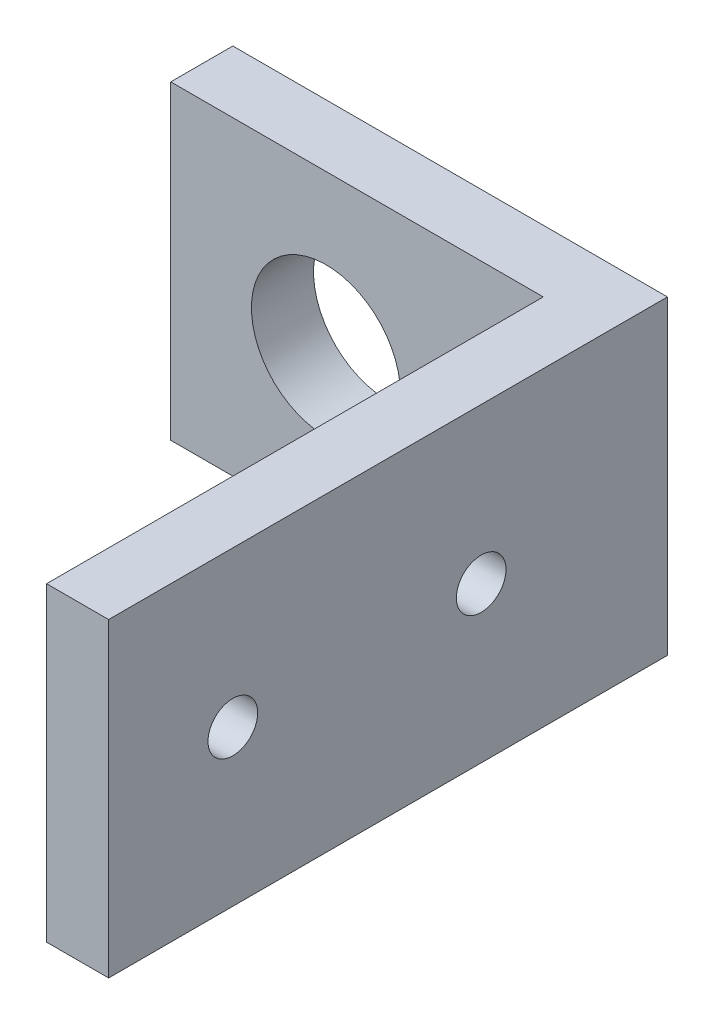
ISO-10303-21;
HEADER;
FILE_DESCRIPTION(('STEP AP214'),'2;1');
FILE_NAME('part.step','',(''),(''),'','','');
FILE_SCHEMA(('AUTOMOTIVE_DESIGN { 1 0 10303 214 1 1 1 1 }'));
ENDSEC;
DATA;
#1=APPLICATION_CONTEXT('core data for automotive mechanical design processes');
#2=APPLICATION_PROTOCOL_DEFINITION('international standard','automotive_design',2000,#1);
#3=PRODUCT_CONTEXT('',#1,'mechanical');
#4=PRODUCT('Part','Part','',(#3));
#5=PRODUCT_RELATED_PRODUCT_CATEGORY('part','',(#4));
#6=PRODUCT_DEFINITION_FORMATION('','',#4);
#7=PRODUCT_DEFINITION_CONTEXT('part definition',#1,'design');
#8=PRODUCT_DEFINITION('design','',#6,#7);
#9=PRODUCT_DEFINITION_SHAPE('','',#8);
#10=(LENGTH_UNIT() NAMED_UNIT(*) SI_UNIT(.MILLI.,.METRE.));
#11=(NAMED_UNIT(*) PLANE_ANGLE_UNIT() SI_UNIT($,.RADIAN.));
#12=(NAMED_UNIT(*) SI_UNIT($,.STERADIAN.) SOLID_ANGLE_UNIT());
#13=UNCERTAINTY_MEASURE_WITH_UNIT(LENGTH_MEASURE(1.E-05),#10,'distance_accuracy_value','');
#14=(GEOMETRIC_REPRESENTATION_CONTEXT(3) GLOBAL_UNCERTAINTY_ASSIGNED_CONTEXT((#13)) GLOBAL_UNIT_ASSIGNED_CONTEXT((#10,
#11,#12)) REPRESENTATION_CONTEXT('',''));
#15=CARTESIAN_POINT('',(0.,0.,0.));
#16=DIRECTION('',(0.,0.,1.));
#17=DIRECTION('',(1.,0.,0.));
#18=AXIS2_PLACEMENT_3D('',#15,#16,#17);
#19=CARTESIAN_POINT('',(0.,0.,5.));
#20=DIRECTION('',(0.,0.,-1.));
#21=DIRECTION('',(-1.,0.,0.));
#22=AXIS2_PLACEMENT_3D('',#19,#20,#21);
#23=PLANE('',#22);
#24=CARTESIAN_POINT('',(12.5,12.5,5.));
#25=DIRECTION('',(0.,0.,1.));
#26=DIRECTION('',(1.,0.,0.));
#27=AXIS2_PLACEMENT_3D('',#24,#25,#26);
#28=CIRCLE('',#27,6.);
#29=CARTESIAN_POINT('',(18.5,12.5,5.));
#30=VERTEX_POINT('',#29);
#31=EDGE_CURVE('E235',#30,#30,#28,.T.);
#32=ORIENTED_EDGE('',*,*,#31,.F.);
#33=EDGE_LOOP('',(#32));
#34=FACE_BOUND('',#33,.T.);
#35=DIRECTION('',(0.,-1.,0.));
#36=VECTOR('',#35,1.);
#37=CARTESIAN_POINT('',(30.,25.,5.));
#38=LINE('',#37,#36);
#39=CARTESIAN_POINT('',(30.,25.,5.));
#40=VERTEX_POINT('',#39);
#41=CARTESIAN_POINT('',(30.,0.,5.));
#42=VERTEX_POINT('',#41);
#43=EDGE_CURVE('E48',#40,#42,#38,.T.);
#44=ORIENTED_EDGE('',*,*,#43,.F.);
#45=DIRECTION('',(-1.,0.,0.));
#46=VECTOR('',#45,1.);
#47=CARTESIAN_POINT('',(0.,25.,5.));
#48=LINE('',#47,#46);
#49=CARTESIAN_POINT('',(0.,25.,5.));
#50=VERTEX_POINT('',#49);
#51=EDGE_CURVE('E53',#40,#50,#48,.T.);
#52=ORIENTED_EDGE('',*,*,#51,.T.);
#53=DIRECTION('',(0.,-1.,0.));
#54=VECTOR('',#53,1.);
#55=CARTESIAN_POINT('',(0.,0.,5.));
#56=LINE('',#55,#54);
#57=CARTESIAN_POINT('',(0.,0.,5.));
#58=VERTEX_POINT('',#57);
#59=EDGE_CURVE('E84',#50,#58,#56,.T.);
#60=ORIENTED_EDGE('',*,*,#59,.T.);
#61=DIRECTION('',(1.,0.,0.));
#62=VECTOR('',#61,1.);
#63=CARTESIAN_POINT('',(0.,0.,5.));
#64=LINE('',#63,#62);
#65=EDGE_CURVE('E138',#58,#42,#64,.T.);
#66=ORIENTED_EDGE('',*,*,#65,.T.);
#67=EDGE_LOOP('',(#44,#52,#60,#66));
#68=FACE_BOUND('',#67,.T.);
#69=ADVANCED_FACE('F33',(#34,#68),#23,.F.);
#70=CARTESIAN_POINT('',(0.,0.,5.));
#71=DIRECTION('',(1.,0.,0.));
#72=DIRECTION('',(0.,0.,-1.));
#73=AXIS2_PLACEMENT_3D('',#70,#71,#72);
#74=PLANE('',#73);
#75=DIRECTION('',(0.,-1.,0.));
#76=VECTOR('',#75,1.);
#77=CARTESIAN_POINT('',(0.,0.,0.));
#78=LINE('',#77,#76);
#79=CARTESIAN_POINT('',(0.,25.,0.));
#80=VERTEX_POINT('',#79);
#81=CARTESIAN_POINT('',(0.,0.,0.));
#82=VERTEX_POINT('',#81);
#83=EDGE_CURVE('E90',#80,#82,#78,.T.);
#84=ORIENTED_EDGE('',*,*,#83,.T.);
#85=DIRECTION('',(0.,0.,-1.));
#86=VECTOR('',#85,1.);
#87=CARTESIAN_POINT('',(0.,0.,5.));
#88=LINE('',#87,#86);
#89=EDGE_CURVE('E11',#58,#82,#88,.T.);
#90=ORIENTED_EDGE('',*,*,#89,.F.);
#91=ORIENTED_EDGE('',*,*,#59,.F.);
#92=DIRECTION('',(0.,0.,-1.));
#93=VECTOR('',#92,1.);
#94=CARTESIAN_POINT('',(0.,25.,5.));
#95=LINE('',#94,#93);
#96=EDGE_CURVE('E76',#50,#80,#95,.T.);
#97=ORIENTED_EDGE('',*,*,#96,.T.);
#98=EDGE_LOOP('',(#84,#90,#91,#97));
#99=FACE_BOUND('',#98,.T.);
#100=ADVANCED_FACE('F35',(#99),#74,.F.);
#101=CARTESIAN_POINT('',(0.,0.,5.));
#102=DIRECTION('',(0.,1.,0.));
#103=DIRECTION('',(0.,0.,1.));
#104=AXIS2_PLACEMENT_3D('',#101,#102,#103);
#105=PLANE('',#104);
#106=DIRECTION('',(1.,0.,0.));
#107=VECTOR('',#106,1.);
#108=CARTESIAN_POINT('',(0.,0.,0.));
#109=LINE('',#108,#107);
#110=CARTESIAN_POINT('',(35.,0.,0.));
#111=VERTEX_POINT('',#110);
#112=EDGE_CURVE('E93',#82,#111,#109,.T.);
#113=ORIENTED_EDGE('',*,*,#112,.T.);
#114=DIRECTION('',(0.,0.,-1.));
#115=VECTOR('',#114,1.);
#116=CARTESIAN_POINT('',(35.,0.,5.));
#117=LINE('',#116,#115);
#118=CARTESIAN_POINT('',(35.,0.,45.));
#119=VERTEX_POINT('',#118);
#120=EDGE_CURVE('E41',#119,#111,#117,.T.);
#121=ORIENTED_EDGE('',*,*,#120,.F.);
#122=DIRECTION('',(1.,0.,0.));
#123=VECTOR('',#122,1.);
#124=CARTESIAN_POINT('',(30.,0.,45.));
#125=LINE('',#124,#123);
#126=CARTESIAN_POINT('',(30.,0.,45.));
#127=VERTEX_POINT('',#126);
#128=EDGE_CURVE('E117',#127,#119,#125,.T.);
#129=ORIENTED_EDGE('',*,*,#128,.F.);
#130=DIRECTION('',(0.,0.,-1.));
#131=VECTOR('',#130,1.);
#132=CARTESIAN_POINT('',(30.,0.,45.));
#133=LINE('',#132,#131);
#134=EDGE_CURVE('E94',#127,#42,#133,.T.);
#135=ORIENTED_EDGE('',*,*,#134,.T.);
#136=ORIENTED_EDGE('',*,*,#65,.F.);
#137=ORIENTED_EDGE('',*,*,#89,.T.);
#138=EDGE_LOOP('',(#113,#121,#129,#135,#136,#137));
#139=FACE_BOUND('',#138,.T.);
#140=ADVANCED_FACE('F115',(#139),#105,.F.);
#141=CARTESIAN_POINT('',(35.,0.,5.));
#142=DIRECTION('',(-1.,0.,0.));
#143=DIRECTION('',(0.,0.,1.));
#144=AXIS2_PLACEMENT_3D('',#141,#142,#143);
#145=PLANE('',#144);
#146=CARTESIAN_POINT('',(35.,12.5,15.));
#147=DIRECTION('',(-1.,0.,0.));
#148=DIRECTION('',(0.,-1.,0.));
#149=AXIS2_PLACEMENT_3D('',#146,#147,#148);
#150=CIRCLE('',#149,2.);
#151=CARTESIAN_POINT('',(35.,10.5,15.));
#152=VERTEX_POINT('',#151);
#153=EDGE_CURVE('E230',#152,#152,#150,.T.);
#154=ORIENTED_EDGE('',*,*,#153,.T.);
#155=EDGE_LOOP('',(#154));
#156=FACE_BOUND('',#155,.T.);
#157=CARTESIAN_POINT('',(35.,12.5,35.));
#158=DIRECTION('',(-1.,0.,0.));
#159=DIRECTION('',(0.,-1.,0.));
#160=AXIS2_PLACEMENT_3D('',#157,#158,#159);
#161=CIRCLE('',#160,2.);
#162=CARTESIAN_POINT('',(35.,10.5,35.));
#163=VERTEX_POINT('',#162);
#164=EDGE_CURVE('E233',#163,#163,#161,.T.);
#165=ORIENTED_EDGE('',*,*,#164,.T.);
#166=EDGE_LOOP('',(#165));
#167=FACE_BOUND('',#166,.T.);
#168=DIRECTION('',(0.,1.,0.));
#169=VECTOR('',#168,1.);
#170=CARTESIAN_POINT('',(35.,0.,0.));
#171=LINE('',#170,#169);
#172=CARTESIAN_POINT('',(35.,25.,0.));
#173=VERTEX_POINT('',#172);
#174=EDGE_CURVE('E85',#111,#173,#171,.T.);
#175=ORIENTED_EDGE('',*,*,#174,.T.);
#176=DIRECTION('',(0.,0.,-1.));
#177=VECTOR('',#176,1.);
#178=CARTESIAN_POINT('',(35.,25.,5.));
#179=LINE('',#178,#177);
#180=CARTESIAN_POINT('',(35.,25.,45.));
#181=VERTEX_POINT('',#180);
#182=EDGE_CURVE('E80',#181,#173,#179,.T.);
#183=ORIENTED_EDGE('',*,*,#182,.F.);
#184=DIRECTION('',(0.,1.,0.));
#185=VECTOR('',#184,1.);
#186=CARTESIAN_POINT('',(35.,25.,45.));
#187=LINE('',#186,#185);
#188=EDGE_CURVE('E111',#119,#181,#187,.T.);
#189=ORIENTED_EDGE('',*,*,#188,.F.);
#190=ORIENTED_EDGE('',*,*,#120,.T.);
#191=EDGE_LOOP('',(#175,#183,#189,#190));
#192=FACE_BOUND('',#191,.T.);
#193=ADVANCED_FACE('F108',(#156,#167,#192),#145,.F.);
#194=CARTESIAN_POINT('',(0.,25.,5.));
#195=DIRECTION('',(0.,-1.,0.));
#196=DIRECTION('',(0.,0.,-1.));
#197=AXIS2_PLACEMENT_3D('',#194,#195,#196);
#198=PLANE('',#197);
#199=DIRECTION('',(-1.,0.,0.));
#200=VECTOR('',#199,1.);
#201=CARTESIAN_POINT('',(0.,25.,0.));
#202=LINE('',#201,#200);
#203=EDGE_CURVE('E73',#173,#80,#202,.T.);
#204=ORIENTED_EDGE('',*,*,#203,.T.);
#205=ORIENTED_EDGE('',*,*,#96,.F.);
#206=ORIENTED_EDGE('',*,*,#51,.F.);
#207=DIRECTION('',(0.,0.,-1.));
#208=VECTOR('',#207,1.);
#209=CARTESIAN_POINT('',(30.,25.,45.));
#210=LINE('',#209,#208);
#211=CARTESIAN_POINT('',(30.,25.,45.));
#212=VERTEX_POINT('',#211);
#213=EDGE_CURVE('E98',#212,#40,#210,.T.);
#214=ORIENTED_EDGE('',*,*,#213,.F.);
#215=DIRECTION('',(-1.,0.,0.));
#216=VECTOR('',#215,1.);
#217=CARTESIAN_POINT('',(30.,25.,45.));
#218=LINE('',#217,#216);
#219=EDGE_CURVE('E128',#181,#212,#218,.T.);
#220=ORIENTED_EDGE('',*,*,#219,.F.);
#221=ORIENTED_EDGE('',*,*,#182,.T.);
#222=EDGE_LOOP('',(#204,#205,#206,#214,#220,#221));
#223=FACE_BOUND('',#222,.T.);
#224=ADVANCED_FACE('F75',(#223),#198,.F.);
#225=CARTESIAN_POINT('',(0.,0.,0.));
#226=DIRECTION('',(0.,0.,-1.));
#227=DIRECTION('',(-1.,0.,0.));
#228=AXIS2_PLACEMENT_3D('',#225,#226,#227);
#229=PLANE('',#228);
#230=CARTESIAN_POINT('',(12.5,12.5,0.));
#231=DIRECTION('',(0.,0.,1.));
#232=DIRECTION('',(1.,0.,0.));
#233=AXIS2_PLACEMENT_3D('',#230,#231,#232);
#234=CIRCLE('',#233,6.);
#235=CARTESIAN_POINT('',(18.5,12.5,0.));
#236=VERTEX_POINT('',#235);
#237=EDGE_CURVE('E135',#236,#236,#234,.T.);
#238=ORIENTED_EDGE('',*,*,#237,.T.);
#239=EDGE_LOOP('',(#238));
#240=FACE_BOUND('',#239,.T.);
#241=ORIENTED_EDGE('',*,*,#83,.F.);
#242=ORIENTED_EDGE('',*,*,#203,.F.);
#243=ORIENTED_EDGE('',*,*,#174,.F.);
#244=ORIENTED_EDGE('',*,*,#112,.F.);
#245=EDGE_LOOP('',(#241,#242,#243,#244));
#246=FACE_BOUND('',#245,.T.);
#247=ADVANCED_FACE('F92',(#240,#246),#229,.T.);
#248=CARTESIAN_POINT('',(30.,25.,45.));
#249=DIRECTION('',(1.,0.,0.));
#250=DIRECTION('',(0.,1.,0.));
#251=AXIS2_PLACEMENT_3D('',#248,#249,#250);
#252=PLANE('',#251);
#253=CARTESIAN_POINT('',(30.,12.5,15.));
#254=DIRECTION('',(-1.,0.,0.));
#255=DIRECTION('',(0.,-1.,0.));
#256=AXIS2_PLACEMENT_3D('',#253,#254,#255);
#257=CIRCLE('',#256,2.);
#258=CARTESIAN_POINT('',(30.,10.5,15.));
#259=VERTEX_POINT('',#258);
#260=EDGE_CURVE('E232',#259,#259,#257,.T.);
#261=ORIENTED_EDGE('',*,*,#260,.F.);
#262=EDGE_LOOP('',(#261));
#263=FACE_BOUND('',#262,.T.);
#264=CARTESIAN_POINT('',(30.,12.5,35.));
#265=DIRECTION('',(-1.,0.,0.));
#266=DIRECTION('',(0.,-1.,0.));
#267=AXIS2_PLACEMENT_3D('',#264,#265,#266);
#268=CIRCLE('',#267,2.);
#269=CARTESIAN_POINT('',(30.,10.5,35.));
#270=VERTEX_POINT('',#269);
#271=EDGE_CURVE('E238',#270,#270,#268,.T.);
#272=ORIENTED_EDGE('',*,*,#271,.F.);
#273=EDGE_LOOP('',(#272));
#274=FACE_BOUND('',#273,.T.);
#275=ORIENTED_EDGE('',*,*,#43,.T.);
#276=ORIENTED_EDGE('',*,*,#134,.F.);
#277=DIRECTION('',(0.,-1.,0.));
#278=VECTOR('',#277,1.);
#279=CARTESIAN_POINT('',(30.,25.,45.));
#280=LINE('',#279,#278);
#281=EDGE_CURVE('E125',#212,#127,#280,.T.);
#282=ORIENTED_EDGE('',*,*,#281,.F.);
#283=ORIENTED_EDGE('',*,*,#213,.T.);
#284=EDGE_LOOP('',(#275,#276,#282,#283));
#285=FACE_BOUND('',#284,.T.);
#286=ADVANCED_FACE('F141',(#263,#274,#285),#252,.F.);
#287=CARTESIAN_POINT('',(0.,0.,45.));
#288=DIRECTION('',(0.,0.,1.));
#289=DIRECTION('',(1.,0.,0.));
#290=AXIS2_PLACEMENT_3D('',#287,#288,#289);
#291=PLANE('',#290);
#292=ORIENTED_EDGE('',*,*,#281,.T.);
#293=ORIENTED_EDGE('',*,*,#128,.T.);
#294=ORIENTED_EDGE('',*,*,#188,.T.);
#295=ORIENTED_EDGE('',*,*,#219,.T.);
#296=EDGE_LOOP('',(#292,#293,#294,#295));
#297=FACE_BOUND('',#296,.T.);
#298=ADVANCED_FACE('F122',(#297),#291,.T.);
#299=CARTESIAN_POINT('',(12.5,12.5,0.));
#300=DIRECTION('',(0.,0.,1.));
#301=DIRECTION('',(1.,0.,0.));
#302=AXIS2_PLACEMENT_3D('',#299,#300,#301);
#303=CYLINDRICAL_SURFACE('',#302,6.);
#304=ORIENTED_EDGE('',*,*,#237,.F.);
#305=EDGE_LOOP('',(#304));
#306=FACE_BOUND('',#305,.T.);
#307=ORIENTED_EDGE('',*,*,#31,.T.);
#308=EDGE_LOOP('',(#307));
#309=FACE_BOUND('',#308,.T.);
#310=ADVANCED_FACE('F153',(#306,#309),#303,.F.);
#311=CARTESIAN_POINT('',(35.,12.5,35.));
#312=DIRECTION('',(-1.,0.,0.));
#313=DIRECTION('',(0.,-1.,0.));
#314=AXIS2_PLACEMENT_3D('',#311,#312,#313);
#315=CYLINDRICAL_SURFACE('',#314,2.);
#316=ORIENTED_EDGE('',*,*,#164,.F.);
#317=EDGE_LOOP('',(#316));
#318=FACE_BOUND('',#317,.T.);
#319=ORIENTED_EDGE('',*,*,#271,.T.);
#320=EDGE_LOOP('',(#319));
#321=FACE_BOUND('',#320,.T.);
#322=ADVANCED_FACE('F200',(#318,#321),#315,.F.);
#323=CARTESIAN_POINT('',(35.,12.5,15.));
#324=DIRECTION('',(-1.,0.,0.));
#325=DIRECTION('',(0.,-1.,0.));
#326=AXIS2_PLACEMENT_3D('',#323,#324,#325);
#327=CYLINDRICAL_SURFACE('',#326,2.);
#328=ORIENTED_EDGE('',*,*,#153,.F.);
#329=EDGE_LOOP('',(#328));
#330=FACE_BOUND('',#329,.T.);
#331=ORIENTED_EDGE('',*,*,#260,.T.);
#332=EDGE_LOOP('',(#331));
#333=FACE_BOUND('',#332,.T.);
#334=ADVANCED_FACE('F213',(#330,#333),#327,.F.);
#335=CLOSED_SHELL('',(#69,#100,#140,#193,#224,#247,#286,#298,#310,#322,#334));
#336=MANIFOLD_SOLID_BREP('B2',#335);
#337=ADVANCED_BREP_SHAPE_REPRESENTATION('',(#18,#336),#14);
#338=SHAPE_DEFINITION_REPRESENTATION(#9,#337);
ENDSEC;
END-ISO-10303-21;
